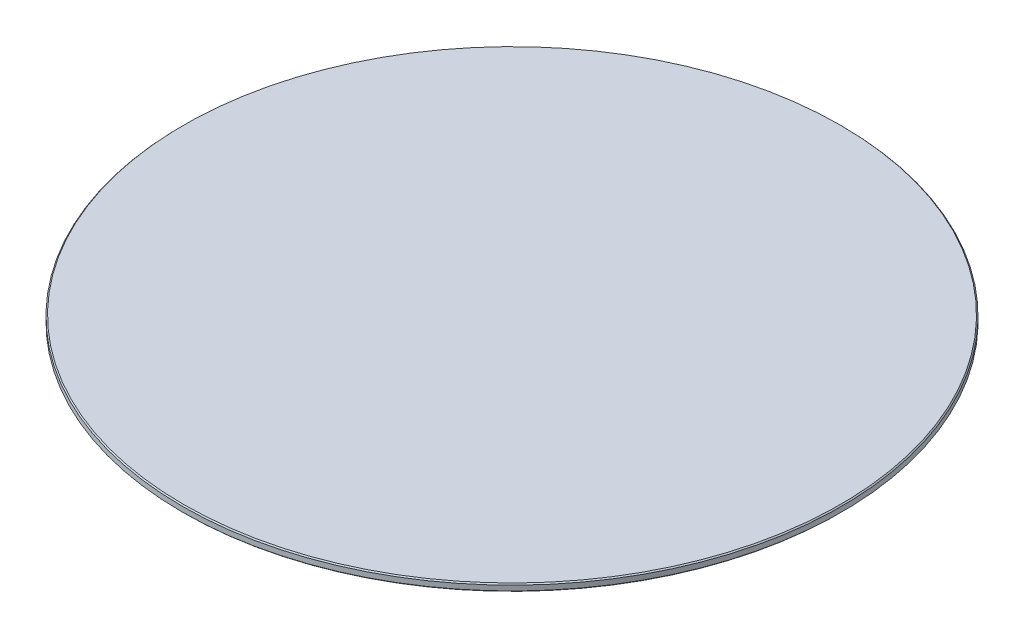
ISO-10303-21;
HEADER;
FILE_DESCRIPTION(('STEP AP214'),'2;1');
FILE_NAME('part.step','',(''),(''),'','','');
FILE_SCHEMA(('AUTOMOTIVE_DESIGN { 1 0 10303 214 1 1 1 1 }'));
ENDSEC;
DATA;
#1=APPLICATION_CONTEXT('core data for automotive mechanical design processes');
#2=APPLICATION_PROTOCOL_DEFINITION('international standard','automotive_design',2000,#1);
#3=PRODUCT_CONTEXT('',#1,'mechanical');
#4=PRODUCT('Part','Part','',(#3));
#5=PRODUCT_RELATED_PRODUCT_CATEGORY('part','',(#4));
#6=PRODUCT_DEFINITION_FORMATION('','',#4);
#7=PRODUCT_DEFINITION_CONTEXT('part definition',#1,'design');
#8=PRODUCT_DEFINITION('design','',#6,#7);
#9=PRODUCT_DEFINITION_SHAPE('','',#8);
#10=(LENGTH_UNIT() NAMED_UNIT(*) SI_UNIT(.MILLI.,.METRE.));
#11=(NAMED_UNIT(*) PLANE_ANGLE_UNIT() SI_UNIT($,.RADIAN.));
#12=(NAMED_UNIT(*) SI_UNIT($,.STERADIAN.) SOLID_ANGLE_UNIT());
#13=UNCERTAINTY_MEASURE_WITH_UNIT(LENGTH_MEASURE(1.E-05),#10,'distance_accuracy_value','');
#14=(GEOMETRIC_REPRESENTATION_CONTEXT(3) GLOBAL_UNCERTAINTY_ASSIGNED_CONTEXT((#13)) GLOBAL_UNIT_ASSIGNED_CONTEXT((#10,
#11,#12)) REPRESENTATION_CONTEXT('',''));
#15=CARTESIAN_POINT('',(0.,0.,0.));
#16=DIRECTION('',(0.,0.,1.));
#17=DIRECTION('',(1.,0.,0.));
#18=AXIS2_PLACEMENT_3D('',#15,#16,#17);
#19=CARTESIAN_POINT('',(0.,3.3,0.));
#20=DIRECTION('',(0.,-1.,0.));
#21=DIRECTION('',(0.,0.,-1.));
#22=AXIS2_PLACEMENT_3D('',#19,#20,#21);
#23=CYLINDRICAL_SURFACE('',#22,150.);
#24=CARTESIAN_POINT('',(0.,0.500000000000028,0.));
#25=DIRECTION('',(0.,1.,0.));
#26=DIRECTION('',(0.,0.,1.));
#27=AXIS2_PLACEMENT_3D('',#24,#25,#26);
#28=CIRCLE('',#27,150.);
#29=CARTESIAN_POINT('',(0.,0.500000000000028,150.));
#30=VERTEX_POINT('',#29);
#31=EDGE_CURVE('E42',#30,#30,#28,.T.);
#32=ORIENTED_EDGE('',*,*,#31,.T.);
#33=EDGE_LOOP('',(#32));
#34=FACE_BOUND('',#33,.T.);
#35=CARTESIAN_POINT('',(0.,2.80000000000003,0.));
#36=DIRECTION('',(0.,1.,0.));
#37=DIRECTION('',(0.,0.,1.));
#38=AXIS2_PLACEMENT_3D('',#35,#36,#37);
#39=CIRCLE('',#38,150.);
#40=CARTESIAN_POINT('',(0.,2.80000000000003,150.));
#41=VERTEX_POINT('',#40);
#42=EDGE_CURVE('E46',#41,#41,#39,.F.);
#43=ORIENTED_EDGE('',*,*,#42,.T.);
#44=EDGE_LOOP('',(#43));
#45=FACE_BOUND('',#44,.T.);
#46=ADVANCED_FACE('F31',(#34,#45),#23,.T.);
#47=CARTESIAN_POINT('',(0.,3.3,0.));
#48=DIRECTION('',(0.,1.,0.));
#49=DIRECTION('',(0.,0.,1.));
#50=AXIS2_PLACEMENT_3D('',#47,#48,#49);
#51=PLANE('',#50);
#52=CARTESIAN_POINT('',(0.,3.3,0.));
#53=DIRECTION('',(0.,1.,0.));
#54=DIRECTION('',(0.,0.,1.));
#55=AXIS2_PLACEMENT_3D('',#52,#53,#54);
#56=CIRCLE('',#55,149.5);
#57=CARTESIAN_POINT('',(0.,3.3,149.5));
#58=VERTEX_POINT('',#57);
#59=EDGE_CURVE('E10',#58,#58,#56,.T.);
#60=ORIENTED_EDGE('',*,*,#59,.T.);
#61=EDGE_LOOP('',(#60));
#62=FACE_BOUND('',#61,.T.);
#63=ADVANCED_FACE('F62',(#62),#51,.T.);
#64=CARTESIAN_POINT('',(0.,0.,0.));
#65=DIRECTION('',(0.,1.,0.));
#66=DIRECTION('',(0.,0.,1.));
#67=AXIS2_PLACEMENT_3D('',#64,#65,#66);
#68=PLANE('',#67);
#69=CARTESIAN_POINT('',(0.,0.,0.));
#70=DIRECTION('',(0.,1.,0.));
#71=DIRECTION('',(0.,0.,1.));
#72=AXIS2_PLACEMENT_3D('',#69,#70,#71);
#73=CIRCLE('',#72,149.5);
#74=CARTESIAN_POINT('',(0.,0.,149.5));
#75=VERTEX_POINT('',#74);
#76=EDGE_CURVE('E38',#75,#75,#73,.F.);
#77=ORIENTED_EDGE('',*,*,#76,.T.);
#78=EDGE_LOOP('',(#77));
#79=FACE_BOUND('',#78,.T.);
#80=ADVANCED_FACE('F59',(#79),#68,.F.);
#81=CARTESIAN_POINT('',(0.,0.500000000000028,0.));
#82=DIRECTION('',(0.,1.,0.));
#83=DIRECTION('',(0.,0.,1.));
#84=AXIS2_PLACEMENT_3D('',#81,#82,#83);
#85=CONICAL_SURFACE('',#84,150.,0.785398163397448);
#86=ORIENTED_EDGE('',*,*,#76,.F.);
#87=EDGE_LOOP('',(#86));
#88=FACE_BOUND('',#87,.T.);
#89=ORIENTED_EDGE('',*,*,#31,.F.);
#90=EDGE_LOOP('',(#89));
#91=FACE_BOUND('',#90,.T.);
#92=ADVANCED_FACE('F55',(#88,#91),#85,.T.);
#93=CARTESIAN_POINT('',(0.,3.3,0.));
#94=DIRECTION('',(0.,-1.,0.));
#95=DIRECTION('',(0.,0.,-1.));
#96=AXIS2_PLACEMENT_3D('',#93,#94,#95);
#97=CONICAL_SURFACE('',#96,149.5,0.785398163397476);
#98=ORIENTED_EDGE('',*,*,#42,.F.);
#99=EDGE_LOOP('',(#98));
#100=FACE_BOUND('',#99,.T.);
#101=ORIENTED_EDGE('',*,*,#59,.F.);
#102=EDGE_LOOP('',(#101));
#103=FACE_BOUND('',#102,.T.);
#104=ADVANCED_FACE('F33',(#100,#103),#97,.T.);
#105=CLOSED_SHELL('',(#46,#63,#80,#92,#104));
#106=MANIFOLD_SOLID_BREP('B2',#105);
#107=ADVANCED_BREP_SHAPE_REPRESENTATION('',(#18,#106),#14);
#108=SHAPE_DEFINITION_REPRESENTATION(#9,#107);
ENDSEC;
END-ISO-10303-21;
